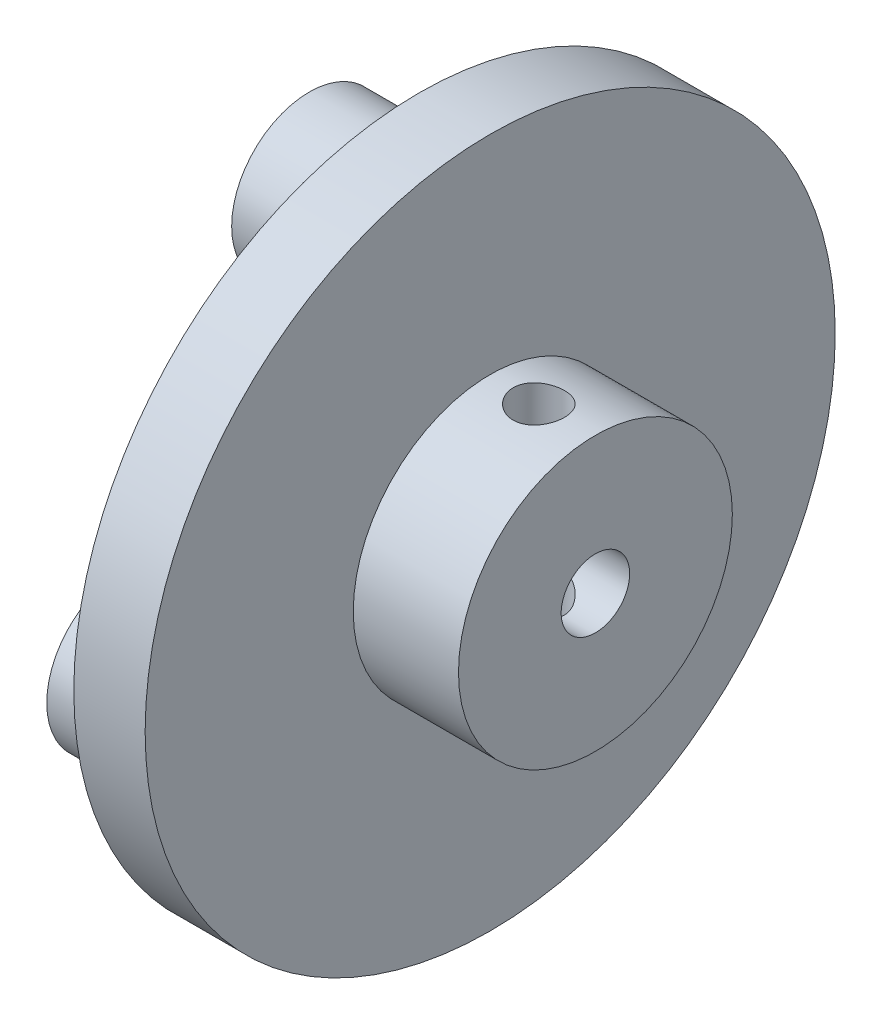
ISO-10303-21;
HEADER;
FILE_DESCRIPTION(('STEP AP214'),'2;1');
FILE_NAME('part.step','',(''),(''),'','','');
FILE_SCHEMA(('AUTOMOTIVE_DESIGN { 1 0 10303 214 1 1 1 1 }'));
ENDSEC;
DATA;
#1=APPLICATION_CONTEXT('core data for automotive mechanical design processes');
#2=APPLICATION_PROTOCOL_DEFINITION('international standard','automotive_design',2000,#1);
#3=PRODUCT_CONTEXT('',#1,'mechanical');
#4=PRODUCT('Part','Part','',(#3));
#5=PRODUCT_RELATED_PRODUCT_CATEGORY('part','',(#4));
#6=PRODUCT_DEFINITION_FORMATION('','',#4);
#7=PRODUCT_DEFINITION_CONTEXT('part definition',#1,'design');
#8=PRODUCT_DEFINITION('design','',#6,#7);
#9=PRODUCT_DEFINITION_SHAPE('','',#8);
#10=(LENGTH_UNIT() NAMED_UNIT(*) SI_UNIT(.MILLI.,.METRE.));
#11=(NAMED_UNIT(*) PLANE_ANGLE_UNIT() SI_UNIT($,.RADIAN.));
#12=(NAMED_UNIT(*) SI_UNIT($,.STERADIAN.) SOLID_ANGLE_UNIT());
#13=UNCERTAINTY_MEASURE_WITH_UNIT(LENGTH_MEASURE(1.E-05),#10,'distance_accuracy_value','');
#14=(GEOMETRIC_REPRESENTATION_CONTEXT(3) GLOBAL_UNCERTAINTY_ASSIGNED_CONTEXT((#13)) GLOBAL_UNIT_ASSIGNED_CONTEXT((#10,
#11,#12)) REPRESENTATION_CONTEXT('',''));
#15=CARTESIAN_POINT('',(0.,0.,0.));
#16=DIRECTION('',(0.,0.,1.));
#17=DIRECTION('',(1.,0.,0.));
#18=AXIS2_PLACEMENT_3D('',#15,#16,#17);
#19=CARTESIAN_POINT('',(-6.42681573579621,0.,0.));
#20=DIRECTION('',(1.,0.,0.));
#21=DIRECTION('',(0.,0.,-1.));
#22=AXIS2_PLACEMENT_3D('',#19,#20,#21);
#23=PLANE('',#22);
#24=CARTESIAN_POINT('',(-6.42681573579621,0.,0.));
#25=DIRECTION('',(1.,0.,0.));
#26=DIRECTION('',(0.,0.,-1.));
#27=AXIS2_PLACEMENT_3D('',#24,#25,#26);
#28=CIRCLE('',#27,5.);
#29=CARTESIAN_POINT('',(-6.42681573579621,0.,-5.));
#30=VERTEX_POINT('',#29);
#31=EDGE_CURVE('E126',#30,#30,#28,.T.);
#32=ORIENTED_EDGE('',*,*,#31,.F.);
#33=EDGE_LOOP('',(#32));
#34=FACE_BOUND('',#33,.T.);
#35=CARTESIAN_POINT('',(-6.42681573579621,0.,0.));
#36=DIRECTION('',(1.,0.,0.));
#37=DIRECTION('',(0.,0.,-1.));
#38=AXIS2_PLACEMENT_3D('',#35,#36,#37);
#39=CIRCLE('',#38,1.5875);
#40=CARTESIAN_POINT('',(-6.42681573579621,0.,-1.5875));
#41=VERTEX_POINT('',#40);
#42=EDGE_CURVE('E129',#41,#41,#39,.T.);
#43=ORIENTED_EDGE('',*,*,#42,.T.);
#44=EDGE_LOOP('',(#43));
#45=FACE_BOUND('',#44,.T.);
#46=ADVANCED_FACE('F47',(#34,#45),#23,.F.);
#47=CARTESIAN_POINT('',(0.,0.,0.));
#48=DIRECTION('',(1.,0.,0.));
#49=DIRECTION('',(0.,0.,-1.));
#50=AXIS2_PLACEMENT_3D('',#47,#48,#49);
#51=CYLINDRICAL_SURFACE('',#50,1.5875);
#52=CARTESIAN_POINT('',(-2.62369481915258,-1.05003255157876,1.190625));
#53=CARTESIAN_POINT('',(-2.56813436430848,-1.050045445975,1.19061880120499));
#54=CARTESIAN_POINT('',(-2.51253343816749,-1.05454741000987,1.18668886577821));
#55=CARTESIAN_POINT('',(-2.4035642457863,-1.07148823701036,1.17140301985762));
#56=CARTESIAN_POINT('',(-2.35020314091834,-1.08395075602632,1.16002497361435));
#57=CARTESIAN_POINT('',(-2.24779081580399,-1.11422757784016,1.13096547199778));
#58=CARTESIAN_POINT('',(-2.19869029009737,-1.13196567044321,1.11337314984434));
#59=CARTESIAN_POINT('',(-2.1043081146867,-1.17067373681068,1.0725995764387));
#60=CARTESIAN_POINT('',(-2.05902600431763,-1.1916433198529,1.04941900067592));
#61=CARTESIAN_POINT('',(-1.96320528707628,-1.2396574216291,0.992504284125243));
#62=CARTESIAN_POINT('',(-1.91355214636031,-1.26705442557768,0.957576618231006));
#63=CARTESIAN_POINT('',(-1.82000273032277,-1.321761740015,0.880535424277006));
#64=CARTESIAN_POINT('',(-1.77611510332648,-1.34907186163527,0.838411314369719));
#65=CARTESIAN_POINT('',(-1.6863881953448,-1.40702174808774,0.737878090100433));
#66=CARTESIAN_POINT('',(-1.64198008306869,-1.43720281226121,0.677900035756592));
#67=CARTESIAN_POINT('',(-1.56433844132807,-1.49131980240358,0.548631836139914));
#68=CARTESIAN_POINT('',(-1.53107865803671,-1.51527037067959,0.479364114482457));
#69=CARTESIAN_POINT('',(-1.48608621846711,-1.54808443073509,0.355496037787017));
#70=CARTESIAN_POINT('',(-1.47088637421967,-1.55931958043549,0.30277280194345));
#71=CARTESIAN_POINT('',(-1.44784141458016,-1.57643223525434,0.194907383645005));
#72=CARTESIAN_POINT('',(-1.43998990936785,-1.58231439499439,0.139767346508665));
#73=CARTESIAN_POINT('',(-1.43210006789922,-1.58822529365106,0.0284679172687339));
#74=CARTESIAN_POINT('',(-1.43208203349128,-1.58823882295637,-0.0276937463004202));
#75=CARTESIAN_POINT('',(-1.43991030647193,-1.58237401411808,-0.139157199360017));
#76=CARTESIAN_POINT('',(-1.44775843508592,-1.57649431153499,-0.194458786708893));
#77=CARTESIAN_POINT('',(-1.47044040305828,-1.55965031243376,-0.300743297572917));
#78=CARTESIAN_POINT('',(-1.48502577822232,-1.54886705851508,-0.35180926291256));
#79=CARTESIAN_POINT('',(-1.52037886013472,-1.52306558684007,-0.450596385005578));
#80=CARTESIAN_POINT('',(-1.5411479149349,-1.50804644569141,-0.498316809620449));
#81=CARTESIAN_POINT('',(-1.59065270117417,-1.472890802502,-0.59469093173013));
#82=CARTESIAN_POINT('',(-1.62000754584371,-1.45237629107677,-0.642886211616419));
#83=CARTESIAN_POINT('',(-1.68447719667917,-1.40859432596468,-0.733875255122701));
#84=CARTESIAN_POINT('',(-1.71959691127687,-1.38532453106985,-0.776664360293094));
#85=CARTESIAN_POINT('',(-1.8023408522792,-1.33265676661186,-0.864458871498922));
#86=CARTESIAN_POINT('',(-1.85106587961103,-1.3029537684393,-0.908244413225474));
#87=CARTESIAN_POINT('',(-1.95522601990249,-1.24401229387742,-0.987431949727557));
#88=CARTESIAN_POINT('',(-2.01066431065059,-1.21477404494797,-1.0228299505536));
#89=CARTESIAN_POINT('',(-2.11647417866004,-1.16537919386833,-1.07849357589208));
#90=CARTESIAN_POINT('',(-2.16569078635997,-1.14456844833299,-1.10036663076556));
#91=CARTESIAN_POINT('',(-2.26814663627921,-1.10757288373056,-1.13759771455097));
#92=CARTESIAN_POINT('',(-2.3213764624068,-1.09137763785656,-1.15297046685305));
#93=CARTESIAN_POINT('',(-2.42024633095124,-1.06870540179809,-1.17397518372094));
#94=CARTESIAN_POINT('',(-2.46529969058283,-1.06093847023266,-1.18093386412912));
#95=CARTESIAN_POINT('',(-2.55650822042805,-1.05120748322928,-1.18960709991958));
#96=CARTESIAN_POINT('',(-2.60266190457544,-1.04923600365031,-1.19132836468154));
#97=CARTESIAN_POINT('',(-2.69471876884096,-1.05142402102457,-1.18939683154219));
#98=CARTESIAN_POINT('',(-2.740621850514,-1.05558577464436,-1.1857420555772));
#99=CARTESIAN_POINT('',(-2.8309240151541,-1.06934967402693,-1.17334131022126));
#100=CARTESIAN_POINT('',(-2.87532039377388,-1.0789611050858,-1.16458665082263));
#101=CARTESIAN_POINT('',(-2.9779756423228,-1.10670783140943,-1.13834830402644));
#102=CARTESIAN_POINT('',(-3.03520335757263,-1.12668703809744,-1.11882388129336));
#103=CARTESIAN_POINT('',(-3.14463902716692,-1.1710817723223,-1.07226796784258));
#104=CARTESIAN_POINT('',(-3.19683749850528,-1.19550543916301,-1.04522265503785));
#105=CARTESIAN_POINT('',(-3.29786559429077,-1.24704699135672,-0.983216332051273));
#106=CARTESIAN_POINT('',(-3.34650966465082,-1.27422976552799,-0.948008248603959));
#107=CARTESIAN_POINT('',(-3.43808398313932,-1.32832083103687,-0.870605343134576));
#108=CARTESIAN_POINT('',(-3.48101143699379,-1.3552289822489,-0.828407126793552));
#109=CARTESIAN_POINT('',(-3.56927093125838,-1.41255926707429,-0.727261145352261));
#110=CARTESIAN_POINT('',(-3.61308453999579,-1.44246738243752,-0.666667665064066));
#111=CARTESIAN_POINT('',(-3.6894000263292,-1.49584651911049,-0.536219092541942));
#112=CARTESIAN_POINT('',(-3.72192638616398,-1.519331448665,-0.466384505042537));
#113=CARTESIAN_POINT('',(-3.76545497486353,-1.55114153831889,-0.341912306313172));
#114=CARTESIAN_POINT('',(-3.77999552381496,-1.56190535686026,-0.28912348300368));
#115=CARTESIAN_POINT('',(-3.80172205122167,-1.57805648311366,-0.181264294065453));
#116=CARTESIAN_POINT('',(-3.8089146051317,-1.58344859766149,-0.126196014246041));
#117=CARTESIAN_POINT('',(-3.81552345445215,-1.58840143581668,-0.0151984122151906));
#118=CARTESIAN_POINT('',(-3.81492149542274,-1.58794847048757,0.0407326247410015));
#119=CARTESIAN_POINT('',(-3.80593703230722,-1.58121987574774,0.151613402505127));
#120=CARTESIAN_POINT('',(-3.79755245547226,-1.57494269517078,0.206562877919336));
#121=CARTESIAN_POINT('',(-3.77385847944483,-1.55736449484374,0.312358036108635));
#122=CARTESIAN_POINT('',(-3.75875717522859,-1.54621460816848,0.363276543980958));
#123=CARTESIAN_POINT('',(-3.72241304206754,-1.51973534456514,0.461693691083553));
#124=CARTESIAN_POINT('',(-3.70116889941179,-1.50440507365769,0.509191596064872));
#125=CARTESIAN_POINT('',(-3.65058670618578,-1.46857753504696,0.605272235896158));
#126=CARTESIAN_POINT('',(-3.6206043923859,-1.44769167461642,0.653368356641276));
#127=CARTESIAN_POINT('',(-3.55486958196267,-1.403234954476,0.744073006806096));
#128=CARTESIAN_POINT('',(-3.51911178205677,-1.37966163294053,0.786676427329303));
#129=CARTESIAN_POINT('',(-3.43490305944494,-1.32640667727172,0.874017021494157));
#130=CARTESIAN_POINT('',(-3.38534048959715,-1.29643919738103,0.91750905161459));
#131=CARTESIAN_POINT('',(-3.27943703708205,-1.2371870295527,0.995959824095467));
#132=CARTESIAN_POINT('',(-3.22309368223605,-1.20790259531752,1.03091544004403));
#133=CARTESIAN_POINT('',(-3.11670623899652,-1.15926871150369,1.0850242722053));
#134=CARTESIAN_POINT('',(-3.06792892662924,-1.13913939849812,1.10595986530786));
#135=CARTESIAN_POINT('',(-2.96652900691447,-1.10357098191916,1.14145534685201));
#136=CARTESIAN_POINT('',(-2.91391705144868,-1.08811945745384,1.15603216594685));
#137=CARTESIAN_POINT('',(-2.82150666984751,-1.06785111060464,1.17472664594127));
#138=CARTESIAN_POINT('',(-2.78247095631577,-1.06124478398383,1.18065747665075));
#139=CARTESIAN_POINT('',(-2.70352834230711,-1.05233228217761,1.18860759763756));
#140=CARTESIAN_POINT('',(-2.66362203090349,-1.05002328532472,1.19062945461798));
#141=CARTESIAN_POINT('',(-2.62369481915258,-1.05003255157876,1.190625));
#142=B_SPLINE_CURVE_WITH_KNOTS('',3,(#52,#53,#54,#55,#56,#57,#58,#59,#60,#61,#62,#63,#64,#65,
#66,#67,#68,#69,#70,#71,#72,#73,#74,#75,#76,#77,#78,#79,#80,#81,#82,#83,#84,#85,#86,#87,#88,#89,
#90,#91,#92,#93,#94,#95,#96,#97,#98,#99,#100,#101,#102,#103,#104,#105,#106,#107,#108,#109,#110,
#111,#112,#113,#114,#115,#116,#117,#118,#119,#120,#121,#122,#123,#124,#125,#126,#127,#128,#129,
#130,#131,#132,#133,#134,#135,#136,#137,#138,#139,#140,#141),.UNSPECIFIED.,.T.,.F.,(4,2,2,2,2,2,
2,2,2,2,2,2,2,2,2,2,2,2,2,2,2,2,2,2,2,2,2,2,2,2,2,2,2,2,2,2,2,2,2,2,2,2,2,2,4),(0.,
0.166474597743314,0.333446217300252,0.498114149835985,0.662762187833674,0.861895093986152,
1.0613233713153,1.30147098182183,1.5410490153444,1.70837006939059,1.87554549222377,
2.04315417765197,2.21080167790273,2.37270731241696,2.53464826848756,2.71412370017785,
2.89375274442083,3.10871804281232,3.32378549783047,3.49646406272525,3.66874938249073,
3.80688854402059,3.9448506680219,4.08286356658931,4.22111232464965,4.41110709885653,
4.60145338469826,4.79856172215235,4.99576605498253,5.23599171487224,5.47569301565586,
5.64239486354326,5.80894740496725,5.97589007623953,6.14287722220568,6.30501670074205,
6.46719088019845,6.64773604163628,6.82844793934811,7.0449089208391,7.26144906140521,
7.43123259464913,7.60056126707079,7.72027294583552,7.83990599300724),.UNSPECIFIED.);
#143=CARTESIAN_POINT('',(-2.62369481915258,-1.05003255157876,1.190625));
#144=VERTEX_POINT('',#143);
#145=EDGE_CURVE('E99',#144,#144,#142,.T.);
#146=ORIENTED_EDGE('',*,*,#145,.F.);
#147=EDGE_LOOP('',(#146));
#148=FACE_BOUND('',#147,.T.);
#149=CARTESIAN_POINT('',(-2.62369481915258,1.05003255157876,1.190625));
#150=CARTESIAN_POINT('',(-2.67925527399667,1.050045445975,1.19061880120499));
#151=CARTESIAN_POINT('',(-2.73485620013766,1.05454741000987,1.18668886577821));
#152=CARTESIAN_POINT('',(-2.84382539251885,1.07148823701036,1.17140301985762));
#153=CARTESIAN_POINT('',(-2.89718649738681,1.08395075602632,1.16002497361435));
#154=CARTESIAN_POINT('',(-2.99959882250116,1.11422757784016,1.13096547199778));
#155=CARTESIAN_POINT('',(-3.04869934820778,1.13196567044321,1.11337314984434));
#156=CARTESIAN_POINT('',(-3.14308152361845,1.17067373681068,1.0725995764387));
#157=CARTESIAN_POINT('',(-3.18836363398752,1.1916433198529,1.04941900067592));
#158=CARTESIAN_POINT('',(-3.28418435122887,1.2396574216291,0.992504284125243));
#159=CARTESIAN_POINT('',(-3.33383749194484,1.26705442557768,0.957576618231006));
#160=CARTESIAN_POINT('',(-3.42738690798238,1.321761740015,0.880535424277006));
#161=CARTESIAN_POINT('',(-3.47127453497867,1.34907186163527,0.838411314369719));
#162=CARTESIAN_POINT('',(-3.56100144296035,1.40702174808774,0.737878090100432));
#163=CARTESIAN_POINT('',(-3.60540955523646,1.43720281226121,0.677900035756592));
#164=CARTESIAN_POINT('',(-3.68305119697708,1.49131980240358,0.548631836139914));
#165=CARTESIAN_POINT('',(-3.71631098026844,1.51527037067959,0.479364114482457));
#166=CARTESIAN_POINT('',(-3.76130341983804,1.54808443073509,0.355496037787017));
#167=CARTESIAN_POINT('',(-3.77650326408548,1.55931958043549,0.30277280194345));
#168=CARTESIAN_POINT('',(-3.79954822372499,1.57643223525434,0.194907383645005));
#169=CARTESIAN_POINT('',(-3.8073997289373,1.58231439499439,0.139767346508665));
#170=CARTESIAN_POINT('',(-3.81528957040593,1.58822529365106,0.028467917268734));
#171=CARTESIAN_POINT('',(-3.81530760481387,1.58823882295637,-0.0276937463004201));
#172=CARTESIAN_POINT('',(-3.80747933183322,1.58237401411808,-0.139157199360017));
#173=CARTESIAN_POINT('',(-3.79963120321923,1.57649431153499,-0.194458786708893));
#174=CARTESIAN_POINT('',(-3.77694923524687,1.55965031243376,-0.300743297572917));
#175=CARTESIAN_POINT('',(-3.76236386008283,1.54886705851508,-0.35180926291256));
#176=CARTESIAN_POINT('',(-3.72701077817043,1.52306558684007,-0.450596385005578));
#177=CARTESIAN_POINT('',(-3.70624172337025,1.50804644569141,-0.498316809620449));
#178=CARTESIAN_POINT('',(-3.65673693713098,1.472890802502,-0.59469093173013));
#179=CARTESIAN_POINT('',(-3.62738209246143,1.45237629107677,-0.642886211616419));
#180=CARTESIAN_POINT('',(-3.56291244162598,1.40859432596468,-0.7338752551227));
#181=CARTESIAN_POINT('',(-3.52779272702828,1.38532453106985,-0.776664360293094));
#182=CARTESIAN_POINT('',(-3.44504878602595,1.33265676661186,-0.864458871498922));
#183=CARTESIAN_POINT('',(-3.39632375869412,1.3029537684393,-0.908244413225474));
#184=CARTESIAN_POINT('',(-3.29216361840266,1.24401229387742,-0.987431949727557));
#185=CARTESIAN_POINT('',(-3.23672532765456,1.21477404494797,-1.0228299505536));
#186=CARTESIAN_POINT('',(-3.13091545964511,1.16537919386833,-1.07849357589208));
#187=CARTESIAN_POINT('',(-3.08169885194518,1.14456844833299,-1.10036663076556));
#188=CARTESIAN_POINT('',(-2.97924300202594,1.10757288373056,-1.13759771455097));
#189=CARTESIAN_POINT('',(-2.92601317589835,1.09137763785656,-1.15297046685305));
#190=CARTESIAN_POINT('',(-2.82714330735391,1.06870540179809,-1.17397518372094));
#191=CARTESIAN_POINT('',(-2.78208994772232,1.06093847023266,-1.18093386412912));
#192=CARTESIAN_POINT('',(-2.6908814178771,1.05120748322928,-1.18960709991958));
#193=CARTESIAN_POINT('',(-2.64472773372971,1.04923600365031,-1.19132836468154));
#194=CARTESIAN_POINT('',(-2.55267086946419,1.05142402102457,-1.18939683154219));
#195=CARTESIAN_POINT('',(-2.50676778779115,1.05558577464436,-1.1857420555772));
#196=CARTESIAN_POINT('',(-2.41646562315105,1.06934967402693,-1.17334131022126));
#197=CARTESIAN_POINT('',(-2.37206924453127,1.0789611050858,-1.16458665082263));
#198=CARTESIAN_POINT('',(-2.26941399598235,1.10670783140943,-1.13834830402645));
#199=CARTESIAN_POINT('',(-2.21218628073252,1.12668703809744,-1.11882388129336));
#200=CARTESIAN_POINT('',(-2.10275061113823,1.1710817723223,-1.07226796784258));
#201=CARTESIAN_POINT('',(-2.05055213979987,1.19550543916301,-1.04522265503785));
#202=CARTESIAN_POINT('',(-1.94952404401438,1.24704699135672,-0.983216332051273));
#203=CARTESIAN_POINT('',(-1.90087997365433,1.27422976552799,-0.948008248603959));
#204=CARTESIAN_POINT('',(-1.80930565516584,1.32832083103687,-0.870605343134576));
#205=CARTESIAN_POINT('',(-1.76637820131136,1.3552289822489,-0.828407126793552));
#206=CARTESIAN_POINT('',(-1.67811870704677,1.41255926707429,-0.727261145352261));
#207=CARTESIAN_POINT('',(-1.63430509830936,1.44246738243752,-0.666667665064067));
#208=CARTESIAN_POINT('',(-1.55798961197595,1.49584651911049,-0.536219092541943));
#209=CARTESIAN_POINT('',(-1.52546325214117,1.519331448665,-0.466384505042537));
#210=CARTESIAN_POINT('',(-1.48193466344162,1.55114153831889,-0.341912306313172));
#211=CARTESIAN_POINT('',(-1.46739411449019,1.56190535686026,-0.28912348300368));
#212=CARTESIAN_POINT('',(-1.44566758708348,1.57805648311366,-0.181264294065453));
#213=CARTESIAN_POINT('',(-1.43847503317345,1.58344859766149,-0.126196014246041));
#214=CARTESIAN_POINT('',(-1.431866183853,1.58840143581668,-0.0151984122151906));
#215=CARTESIAN_POINT('',(-1.43246814288241,1.58794847048757,0.0407326247410015));
#216=CARTESIAN_POINT('',(-1.44145260599793,1.58121987574774,0.151613402505127));
#217=CARTESIAN_POINT('',(-1.44983718283289,1.57494269517078,0.206562877919336));
#218=CARTESIAN_POINT('',(-1.47353115886032,1.55736449484374,0.312358036108635));
#219=CARTESIAN_POINT('',(-1.48863246307656,1.54621460816848,0.363276543980958));
#220=CARTESIAN_POINT('',(-1.52497659623761,1.51973534456514,0.461693691083553));
#221=CARTESIAN_POINT('',(-1.54622073889336,1.50440507365769,0.509191596064872));
#222=CARTESIAN_POINT('',(-1.59680293211937,1.46857753504696,0.605272235896158));
#223=CARTESIAN_POINT('',(-1.62678524591925,1.44769167461642,0.653368356641276));
#224=CARTESIAN_POINT('',(-1.69252005634248,1.403234954476,0.744073006806096));
#225=CARTESIAN_POINT('',(-1.72827785624838,1.37966163294053,0.786676427329303));
#226=CARTESIAN_POINT('',(-1.81248657886021,1.32640667727172,0.874017021494157));
#227=CARTESIAN_POINT('',(-1.862049148708,1.29643919738103,0.91750905161459));
#228=CARTESIAN_POINT('',(-1.9679526012231,1.2371870295527,0.995959824095467));
#229=CARTESIAN_POINT('',(-2.0242959560691,1.20790259531752,1.03091544004403));
#230=CARTESIAN_POINT('',(-2.13068339930863,1.15926871150369,1.0850242722053));
#231=CARTESIAN_POINT('',(-2.17946071167591,1.13913939849812,1.10595986530786));
#232=CARTESIAN_POINT('',(-2.28086063139068,1.10357098191916,1.14145534685201));
#233=CARTESIAN_POINT('',(-2.33347258685646,1.08811945745384,1.15603216594685));
#234=CARTESIAN_POINT('',(-2.42588296845764,1.06785111060464,1.17472664594127));
#235=CARTESIAN_POINT('',(-2.46491868198938,1.06124478398383,1.18065747665075));
#236=CARTESIAN_POINT('',(-2.54386129599804,1.05233228217761,1.18860759763756));
#237=CARTESIAN_POINT('',(-2.58376760740166,1.05002328532472,1.19062945461798));
#238=CARTESIAN_POINT('',(-2.62369481915258,1.05003255157876,1.190625));
#239=B_SPLINE_CURVE_WITH_KNOTS('',3,(#149,#150,#151,#152,#153,#154,#155,#156,#157,#158,#159,
#160,#161,#162,#163,#164,#165,#166,#167,#168,#169,#170,#171,#172,#173,#174,#175,#176,#177,#178,
#179,#180,#181,#182,#183,#184,#185,#186,#187,#188,#189,#190,#191,#192,#193,#194,#195,#196,#197,
#198,#199,#200,#201,#202,#203,#204,#205,#206,#207,#208,#209,#210,#211,#212,#213,#214,#215,#216,
#217,#218,#219,#220,#221,#222,#223,#224,#225,#226,#227,#228,#229,#230,#231,#232,#233,#234,#235,
#236,#237,#238),.UNSPECIFIED.,.T.,.F.,(4,2,2,2,2,2,2,2,2,2,2,2,2,2,2,2,2,2,2,2,2,2,2,2,2,2,2,2,
2,2,2,2,2,2,2,2,2,2,2,2,2,2,2,2,4),(0.,0.166474597743314,0.333446217300252,0.498114149835985,
0.662762187833674,0.861895093986153,1.0613233713153,1.30147098182183,1.5410490153444,
1.70837006939059,1.87554549222377,2.04315417765197,2.21080167790273,2.37270731241696,
2.53464826848756,2.71412370017785,2.89375274442083,3.10871804281232,3.32378549783047,
3.49646406272525,3.66874938249073,3.80688854402059,3.94485066802191,4.08286356658931,
4.22111232464965,4.41110709885653,4.60145338469826,4.79856172215235,4.99576605498253,
5.23599171487224,5.47569301565586,5.64239486354326,5.80894740496725,5.97589007623953,
6.14287722220569,6.30501670074205,6.46719088019845,6.64773604163628,6.82844793934812,
7.0449089208391,7.26144906140521,7.43123259464913,7.6005612670708,7.72027294583552,
7.83990599300725),.UNSPECIFIED.);
#240=CARTESIAN_POINT('',(-2.62369481915258,1.05003255157876,1.190625));
#241=VERTEX_POINT('',#240);
#242=EDGE_CURVE('E93',#241,#241,#239,.T.);
#243=ORIENTED_EDGE('',*,*,#242,.F.);
#244=EDGE_LOOP('',(#243));
#245=FACE_BOUND('',#244,.T.);
#246=CARTESIAN_POINT('',(0.,0.,0.));
#247=DIRECTION('',(1.,0.,0.));
#248=DIRECTION('',(0.,0.,-1.));
#249=AXIS2_PLACEMENT_3D('',#246,#247,#248);
#250=CIRCLE('',#249,1.5875);
#251=CARTESIAN_POINT('',(0.,0.,-1.5875));
#252=VERTEX_POINT('',#251);
#253=EDGE_CURVE('E132',#252,#252,#250,.T.);
#254=ORIENTED_EDGE('',*,*,#253,.T.);
#255=EDGE_LOOP('',(#254));
#256=FACE_BOUND('',#255,.T.);
#257=ORIENTED_EDGE('',*,*,#42,.F.);
#258=EDGE_LOOP('',(#257));
#259=FACE_BOUND('',#258,.T.);
#260=ADVANCED_FACE('F104',(#148,#245,#256,#259),#51,.F.);
#261=CARTESIAN_POINT('',(0.,0.,0.));
#262=DIRECTION('',(1.,0.,0.));
#263=DIRECTION('',(0.,0.,-1.));
#264=AXIS2_PLACEMENT_3D('',#261,#262,#263);
#265=PLANE('',#264);
#266=CARTESIAN_POINT('',(0.,0.,0.));
#267=DIRECTION('',(1.,0.,0.));
#268=DIRECTION('',(0.,0.,-1.));
#269=AXIS2_PLACEMENT_3D('',#266,#267,#268);
#270=CIRCLE('',#269,6.35);
#271=CARTESIAN_POINT('',(0.,0.,-6.35));
#272=VERTEX_POINT('',#271);
#273=EDGE_CURVE('E138',#272,#272,#270,.T.);
#274=ORIENTED_EDGE('',*,*,#273,.T.);
#275=EDGE_LOOP('',(#274));
#276=FACE_BOUND('',#275,.T.);
#277=ORIENTED_EDGE('',*,*,#253,.F.);
#278=EDGE_LOOP('',(#277));
#279=FACE_BOUND('',#278,.T.);
#280=ADVANCED_FACE('F107',(#276,#279),#265,.T.);
#281=CARTESIAN_POINT('',(0.,0.,0.));
#282=DIRECTION('',(1.,0.,0.));
#283=DIRECTION('',(0.,0.,-1.));
#284=AXIS2_PLACEMENT_3D('',#281,#282,#283);
#285=CYLINDRICAL_SURFACE('',#284,6.35);
#286=CARTESIAN_POINT('',(-2.62369481915258,-6.23738022805849,1.190625));
#287=CARTESIAN_POINT('',(-2.689938978003,-6.23738151031385,1.19062245907442));
#288=CARTESIAN_POINT('',(-2.75621610302296,-6.23844700897501,1.18507769040044));
#289=CARTESIAN_POINT('',(-2.88690149488208,-6.24258856832369,1.16306007269174));
#290=CARTESIAN_POINT('',(-2.95130812793668,-6.24566633455276,1.14657795328794));
#291=CARTESIAN_POINT('',(-3.07634271956241,-6.25347187545005,1.10320959521414));
#292=CARTESIAN_POINT('',(-3.1369741371677,-6.25819811268953,1.07633304826229));
#293=CARTESIAN_POINT('',(-3.25286358183402,-6.26876624648693,1.01296442822345));
#294=CARTESIAN_POINT('',(-3.30812202773578,-6.27460805597694,0.976473105463744));
#295=CARTESIAN_POINT('',(-3.41238878976756,-6.28683031776661,0.894426701606916));
#296=CARTESIAN_POINT('',(-3.46132052790844,-6.29321605071163,0.848775075156375));
#297=CARTESIAN_POINT('',(-3.55087767839705,-6.30576000771296,0.749912599425359));
#298=CARTESIAN_POINT('',(-3.59150254541471,-6.31191821681104,0.696701254252311));
#299=CARTESIAN_POINT('',(-3.66358619932928,-6.32336982901169,0.583726841315056));
#300=CARTESIAN_POINT('',(-3.69497278638363,-6.32865628516529,0.523916941776878));
#301=CARTESIAN_POINT('',(-3.74722376833218,-6.33770964352422,0.399757331080296));
#302=CARTESIAN_POINT('',(-3.76808902831981,-6.34147667065624,0.335407993663484));
#303=CARTESIAN_POINT('',(-3.79846827336267,-6.3470294312949,0.204789679786261));
#304=CARTESIAN_POINT('',(-3.80811134947871,-6.34883767993707,0.138551700325605));
#305=CARTESIAN_POINT('',(-3.81617472376477,-6.3503467466363,0.0053750178530858));
#306=CARTESIAN_POINT('',(-3.81459597758795,-6.35004774414741,-0.0615636250053379));
#307=CARTESIAN_POINT('',(-3.80035952580452,-6.34739359299572,-0.193356196582646));
#308=CARTESIAN_POINT('',(-3.7878408196675,-6.34506424221226,-0.258225734858354));
#309=CARTESIAN_POINT('',(-3.75229964744511,-6.33864005902264,-0.384926812786658));
#310=CARTESIAN_POINT('',(-3.72927679855934,-6.33454516227535,-0.446758241631066));
#311=CARTESIAN_POINT('',(-3.67324843262505,-6.32500687861013,-0.56603111469027));
#312=CARTESIAN_POINT('',(-3.64018735062203,-6.31955601712718,-0.623445835146835));
#313=CARTESIAN_POINT('',(-3.56506194432258,-6.30790860862137,-0.731964481914119));
#314=CARTESIAN_POINT('',(-3.52299670443556,-6.30171198579361,-0.783067765610435));
#315=CARTESIAN_POINT('',(-3.4302911049094,-6.2891472648395,-0.878336460056673));
#316=CARTESIAN_POINT('',(-3.3795291406803,-6.28277799434412,-0.922383464134014));
#317=CARTESIAN_POINT('',(-3.27127612870017,-6.27067666458918,-1.00135667656938));
#318=CARTESIAN_POINT('',(-3.2137849825019,-6.26494461465447,-1.03628275146501));
#319=CARTESIAN_POINT('',(-3.09354856678234,-6.25476502812528,-1.09605645203179));
#320=CARTESIAN_POINT('',(-3.0307945437575,-6.25031968858395,-1.12088686831053));
#321=CARTESIAN_POINT('',(-2.90190325425478,-6.24325048652372,-1.15961840223951));
#322=CARTESIAN_POINT('',(-2.83576637203365,-6.24062641761904,-1.17352075827755));
#323=CARTESIAN_POINT('',(-2.70305447687322,-6.23753769238923,-1.1898286516573));
#324=CARTESIAN_POINT('',(-2.63650108992245,-6.23704108679058,-1.192404304019));
#325=CARTESIAN_POINT('',(-2.50391520167715,-6.23817801940292,-1.18644169049869));
#326=CARTESIAN_POINT('',(-2.43788267478503,-6.23981145226898,-1.17790397424856));
#327=CARTESIAN_POINT('',(-2.30877220235315,-6.24499465425169,-1.15010301630482));
#328=CARTESIAN_POINT('',(-2.24567435613156,-6.24852848185885,-1.13092895626042));
#329=CARTESIAN_POINT('',(-2.12358692480426,-6.25710056486816,-1.08249421850879));
#330=CARTESIAN_POINT('',(-2.06459764287103,-6.26213893114604,-1.05323279739731));
#331=CARTESIAN_POINT('',(-1.95165239653706,-6.273225149293,-0.985062427887302));
#332=CARTESIAN_POINT('',(-1.89776239222138,-6.27928398243844,-0.946046015889492));
#333=CARTESIAN_POINT('',(-1.79723276223245,-6.2916975652343,-0.859618108232458));
#334=CARTESIAN_POINT('',(-1.75059378916768,-6.29805234145342,-0.812205857750102));
#335=CARTESIAN_POINT('',(-1.66525458184736,-6.31044445304719,-0.709572350434619));
#336=CARTESIAN_POINT('',(-1.62666875678409,-6.31647641192686,-0.654255211438614));
#337=CARTESIAN_POINT('',(-1.55933861174905,-6.32745277568216,-0.537824777663112));
#338=CARTESIAN_POINT('',(-1.53059391288273,-6.33239722242563,-0.476711706149333));
#339=CARTESIAN_POINT('',(-1.48393324147296,-6.34061833534204,-0.350740298628081));
#340=CARTESIAN_POINT('',(-1.46596108277571,-6.3439036406705,-0.285903362881447));
#341=CARTESIAN_POINT('',(-1.44117634957248,-6.34847315903972,-0.154063880484122));
#342=CARTESIAN_POINT('',(-1.43436260083905,-6.34975758263759,-0.0870615624588323));
#343=CARTESIAN_POINT('',(-1.43212898607231,-6.35017643090381,0.0461095409488416));
#344=CARTESIAN_POINT('',(-1.43653632135601,-6.34934346258619,0.11227538748385));
#345=CARTESIAN_POINT('',(-1.45624130869377,-6.34568887873039,0.242906049365365));
#346=CARTESIAN_POINT('',(-1.47153885634329,-6.3428672822572,0.307370881013366));
#347=CARTESIAN_POINT('',(-1.5125172150134,-6.33555246395074,0.432678265003916));
#348=CARTESIAN_POINT('',(-1.53817963312687,-6.33106220435378,0.49352701595884));
#349=CARTESIAN_POINT('',(-1.59913855424138,-6.32089614079585,0.610080719857626));
#350=CARTESIAN_POINT('',(-1.63443570269973,-6.31522025741262,0.665785327846346));
#351=CARTESIAN_POINT('',(-1.71425691111617,-6.30320669013837,0.77133055330038));
#352=CARTESIAN_POINT('',(-1.7589058085303,-6.29686069644355,0.821075824341234));
#353=CARTESIAN_POINT('',(-1.85590406563117,-6.28427459121416,0.912427817519787));
#354=CARTESIAN_POINT('',(-1.90825523401174,-6.27803450493435,0.954032622702936));
#355=CARTESIAN_POINT('',(-2.01975144257333,-6.26630364581951,1.0282843444415));
#356=CARTESIAN_POINT('',(-2.07895486188866,-6.26082034029538,1.06084481547176));
#357=CARTESIAN_POINT('',(-2.20207528994909,-6.25131373440504,1.11550555111084));
#358=CARTESIAN_POINT('',(-2.26598778325827,-6.24728905676022,1.13761568925877));
#359=CARTESIAN_POINT('',(-2.37902319780462,-6.24199456683126,1.16625470485721));
#360=CARTESIAN_POINT('',(-2.42748436238774,-6.24027446636446,1.1753779018103));
#361=CARTESIAN_POINT('',(-2.52518922846208,-6.23796683562345,1.18756391166722));
#362=CARTESIAN_POINT('',(-2.57443290861546,-6.2373792745201,1.1906268895379));
#363=CARTESIAN_POINT('',(-2.62369481915258,-6.23738022805849,1.190625));
#364=B_SPLINE_CURVE_WITH_KNOTS('',3,(#286,#287,#288,#289,#290,#291,#292,#293,#294,#295,#296,
#297,#298,#299,#300,#301,#302,#303,#304,#305,#306,#307,#308,#309,#310,#311,#312,#313,#314,#315,
#316,#317,#318,#319,#320,#321,#322,#323,#324,#325,#326,#327,#328,#329,#330,#331,#332,#333,#334,
#335,#336,#337,#338,#339,#340,#341,#342,#343,#344,#345,#346,#347,#348,#349,#350,#351,#352,#353,
#354,#355,#356,#357,#358,#359,#360,#361,#362,#363),.UNSPECIFIED.,.T.,.F.,(4,2,2,2,2,2,2,2,2,2,2,
2,2,2,2,2,2,2,2,2,2,2,2,2,2,2,2,2,2,2,2,2,2,2,2,2,2,2,4),(0.,0.198552201459807,
0.397272908738174,0.595808774681619,0.794329151675382,0.995063539582096,1.19581110108642,
1.39808826573636,1.60034879586963,1.80025893643956,2.00015205281638,2.19754172660111,
2.39493859439311,2.59344868009848,2.79197896096103,2.9935536296635,3.19513124775091,
3.39705105541248,3.59894797785148,3.79780203563365,3.99664625909981,4.19384791397697,
4.39106410505425,4.590556784791,4.79006740891898,4.99224399609721,5.19441279837102,
5.39551776348454,5.59660156445817,5.79460757324921,5.99261168378094,6.19026596055845,
6.3879334819958,6.58843030804315,6.78897429133668,6.99137382690505,7.19358174998237,
7.341237440971,7.48888911252961),.UNSPECIFIED.);
#365=CARTESIAN_POINT('',(-2.62369481915258,-6.23738022805849,1.190625));
#366=VERTEX_POINT('',#365);
#367=EDGE_CURVE('E50',#366,#366,#364,.T.);
#368=ORIENTED_EDGE('',*,*,#367,.F.);
#369=EDGE_LOOP('',(#368));
#370=FACE_BOUND('',#369,.T.);
#371=CARTESIAN_POINT('',(-2.62369481915258,6.23738022805849,1.190625));
#372=CARTESIAN_POINT('',(-2.55745066030215,6.23738151031385,1.19062245907442));
#373=CARTESIAN_POINT('',(-2.49117353528219,6.23844700897501,1.18507769040044));
#374=CARTESIAN_POINT('',(-2.36048814342307,6.24258856832369,1.16306007269174));
#375=CARTESIAN_POINT('',(-2.29608151036847,6.24566633455276,1.14657795328794));
#376=CARTESIAN_POINT('',(-2.17104691874274,6.25347187545005,1.10320959521414));
#377=CARTESIAN_POINT('',(-2.11041550113745,6.25819811268953,1.07633304826229));
#378=CARTESIAN_POINT('',(-1.99452605647113,6.26876624648693,1.01296442822345));
#379=CARTESIAN_POINT('',(-1.93926761056937,6.27460805597694,0.976473105463744));
#380=CARTESIAN_POINT('',(-1.83500084853759,6.28683031776661,0.894426701606916));
#381=CARTESIAN_POINT('',(-1.78606911039671,6.29321605071163,0.848775075156375));
#382=CARTESIAN_POINT('',(-1.6965119599081,6.30576000771296,0.749912599425359));
#383=CARTESIAN_POINT('',(-1.65588709289044,6.31191821681104,0.69670125425231));
#384=CARTESIAN_POINT('',(-1.58380343897587,6.32336982901169,0.583726841315055));
#385=CARTESIAN_POINT('',(-1.55241685192152,6.32865628516529,0.523916941776878));
#386=CARTESIAN_POINT('',(-1.50016586997297,6.33770964352422,0.399757331080295));
#387=CARTESIAN_POINT('',(-1.47930060998534,6.34147667065624,0.335407993663483));
#388=CARTESIAN_POINT('',(-1.44892136494248,6.3470294312949,0.20478967978626));
#389=CARTESIAN_POINT('',(-1.43927828882644,6.34883767993707,0.138551700325605));
#390=CARTESIAN_POINT('',(-1.43121491454038,6.3503467466363,0.00537501785308539));
#391=CARTESIAN_POINT('',(-1.4327936607172,6.35004774414741,-0.0615636250053382));
#392=CARTESIAN_POINT('',(-1.44703011250063,6.34739359299572,-0.193356196582646));
#393=CARTESIAN_POINT('',(-1.45954881863765,6.34506424221226,-0.258225734858354));
#394=CARTESIAN_POINT('',(-1.49508999086004,6.33864005902264,-0.384926812786659));
#395=CARTESIAN_POINT('',(-1.51811283974581,6.33454516227535,-0.446758241631067));
#396=CARTESIAN_POINT('',(-1.5741412056801,6.32500687861013,-0.56603111469027));
#397=CARTESIAN_POINT('',(-1.60720228768312,6.31955601712718,-0.623445835146835));
#398=CARTESIAN_POINT('',(-1.68232769398257,6.30790860862137,-0.731964481914119));
#399=CARTESIAN_POINT('',(-1.72439293386959,6.30171198579361,-0.783067765610435));
#400=CARTESIAN_POINT('',(-1.81709853339575,6.2891472648395,-0.878336460056674));
#401=CARTESIAN_POINT('',(-1.86786049762485,6.28277799434412,-0.922383464134014));
#402=CARTESIAN_POINT('',(-1.97611350960498,6.27067666458918,-1.00135667656938));
#403=CARTESIAN_POINT('',(-2.03360465580325,6.26494461465447,-1.03628275146501));
#404=CARTESIAN_POINT('',(-2.15384107152281,6.25476502812528,-1.09605645203179));
#405=CARTESIAN_POINT('',(-2.21659509454765,6.25031968858395,-1.12088686831053));
#406=CARTESIAN_POINT('',(-2.34548638405037,6.24325048652372,-1.15961840223951));
#407=CARTESIAN_POINT('',(-2.4116232662715,6.24062641761904,-1.17352075827755));
#408=CARTESIAN_POINT('',(-2.54433516143193,6.23753769238923,-1.1898286516573));
#409=CARTESIAN_POINT('',(-2.6108885483827,6.23704108679058,-1.192404304019));
#410=CARTESIAN_POINT('',(-2.743474436628,6.23817801940292,-1.18644169049869));
#411=CARTESIAN_POINT('',(-2.80950696352012,6.23981145226898,-1.17790397424856));
#412=CARTESIAN_POINT('',(-2.938617435952,6.24499465425169,-1.15010301630482));
#413=CARTESIAN_POINT('',(-3.00171528217359,6.24852848185885,-1.13092895626042));
#414=CARTESIAN_POINT('',(-3.12380271350089,6.25710056486816,-1.08249421850879));
#415=CARTESIAN_POINT('',(-3.18279199543412,6.26213893114604,-1.05323279739731));
#416=CARTESIAN_POINT('',(-3.29573724176809,6.273225149293,-0.985062427887301));
#417=CARTESIAN_POINT('',(-3.34962724608377,6.27928398243844,-0.946046015889492));
#418=CARTESIAN_POINT('',(-3.4501568760727,6.2916975652343,-0.859618108232457));
#419=CARTESIAN_POINT('',(-3.49679584913747,6.29805234145342,-0.812205857750101));
#420=CARTESIAN_POINT('',(-3.58213505645779,6.31044445304719,-0.709572350434618));
#421=CARTESIAN_POINT('',(-3.62072088152106,6.31647641192686,-0.654255211438612));
#422=CARTESIAN_POINT('',(-3.6880510265561,6.32745277568216,-0.537824777663111));
#423=CARTESIAN_POINT('',(-3.71679572542242,6.33239722242563,-0.476711706149332));
#424=CARTESIAN_POINT('',(-3.76345639683219,6.34061833534204,-0.35074029862808));
#425=CARTESIAN_POINT('',(-3.78142855552944,6.3439036406705,-0.285903362881446));
#426=CARTESIAN_POINT('',(-3.80621328873267,6.34847315903972,-0.154063880484121));
#427=CARTESIAN_POINT('',(-3.8130270374661,6.34975758263759,-0.0870615624588314));
#428=CARTESIAN_POINT('',(-3.81526065223284,6.35017643090381,0.0461095409488419));
#429=CARTESIAN_POINT('',(-3.81085331694914,6.34934346258619,0.112275387483851));
#430=CARTESIAN_POINT('',(-3.79114832961138,6.34568887873039,0.242906049365365));
#431=CARTESIAN_POINT('',(-3.77585078196186,6.3428672822572,0.307370881013366));
#432=CARTESIAN_POINT('',(-3.73487242329175,6.33555246395074,0.432678265003916));
#433=CARTESIAN_POINT('',(-3.70921000517828,6.33106220435378,0.493527015958841));
#434=CARTESIAN_POINT('',(-3.64825108406377,6.32089614079585,0.610080719857626));
#435=CARTESIAN_POINT('',(-3.61295393560542,6.31522025741262,0.665785327846346));
#436=CARTESIAN_POINT('',(-3.53313272718898,6.30320669013837,0.771330553300381));
#437=CARTESIAN_POINT('',(-3.48848382977485,6.29686069644355,0.821075824341235));
#438=CARTESIAN_POINT('',(-3.39148557267398,6.28427459121416,0.912427817519787));
#439=CARTESIAN_POINT('',(-3.33913440429341,6.27803450493435,0.954032622702936));
#440=CARTESIAN_POINT('',(-3.22763819573182,6.26630364581951,1.0282843444415));
#441=CARTESIAN_POINT('',(-3.16843477641649,6.26082034029538,1.06084481547176));
#442=CARTESIAN_POINT('',(-3.04531434835606,6.25131373440504,1.11550555111084));
#443=CARTESIAN_POINT('',(-2.98140185504688,6.24728905676022,1.13761568925877));
#444=CARTESIAN_POINT('',(-2.86836644050053,6.24199456683126,1.16625470485721));
#445=CARTESIAN_POINT('',(-2.81990527591741,6.24027446636446,1.1753779018103));
#446=CARTESIAN_POINT('',(-2.72220040984307,6.23796683562345,1.18756391166722));
#447=CARTESIAN_POINT('',(-2.67295672968969,6.2373792745201,1.1906268895379));
#448=CARTESIAN_POINT('',(-2.62369481915258,6.23738022805849,1.190625));
#449=B_SPLINE_CURVE_WITH_KNOTS('',3,(#371,#372,#373,#374,#375,#376,#377,#378,#379,#380,#381,
#382,#383,#384,#385,#386,#387,#388,#389,#390,#391,#392,#393,#394,#395,#396,#397,#398,#399,#400,
#401,#402,#403,#404,#405,#406,#407,#408,#409,#410,#411,#412,#413,#414,#415,#416,#417,#418,#419,
#420,#421,#422,#423,#424,#425,#426,#427,#428,#429,#430,#431,#432,#433,#434,#435,#436,#437,#438,
#439,#440,#441,#442,#443,#444,#445,#446,#447,#448),.UNSPECIFIED.,.T.,.F.,(4,2,2,2,2,2,2,2,2,2,2,
2,2,2,2,2,2,2,2,2,2,2,2,2,2,2,2,2,2,2,2,2,2,2,2,2,2,2,4),(0.,0.198552201459807,
0.397272908738174,0.595808774681619,0.794329151675382,0.995063539582097,1.19581110108642,
1.39808826573636,1.60034879586963,1.80025893643956,2.00015205281638,2.19754172660111,
2.39493859439311,2.59344868009848,2.79197896096103,2.9935536296635,3.19513124775091,
3.39705105541248,3.59894797785148,3.79780203563365,3.99664625909981,4.19384791397698,
4.39106410505426,4.590556784791,4.79006740891899,4.99224399609721,5.19441279837102,
5.39551776348454,5.59660156445817,5.79460757324921,5.99261168378094,6.19026596055845,
6.3879334819958,6.58843030804315,6.78897429133668,6.99137382690505,7.19358174998237,
7.341237440971,7.48888911252961),.UNSPECIFIED.);
#450=CARTESIAN_POINT('',(-2.62369481915258,6.23738022805849,1.190625));
#451=VERTEX_POINT('',#450);
#452=EDGE_CURVE('E69',#451,#451,#449,.T.);
#453=ORIENTED_EDGE('',*,*,#452,.F.);
#454=EDGE_LOOP('',(#453));
#455=FACE_BOUND('',#454,.T.);
#456=CARTESIAN_POINT('',(-4.87911158009766,0.,0.));
#457=DIRECTION('',(1.,0.,0.));
#458=DIRECTION('',(0.,0.,-1.));
#459=AXIS2_PLACEMENT_3D('',#456,#457,#458);
#460=CIRCLE('',#459,6.35);
#461=CARTESIAN_POINT('',(-4.87911158009766,0.,-6.35));
#462=VERTEX_POINT('',#461);
#463=EDGE_CURVE('E143',#462,#462,#460,.T.);
#464=ORIENTED_EDGE('',*,*,#463,.T.);
#465=EDGE_LOOP('',(#464));
#466=FACE_BOUND('',#465,.T.);
#467=ORIENTED_EDGE('',*,*,#273,.F.);
#468=EDGE_LOOP('',(#467));
#469=FACE_BOUND('',#468,.T.);
#470=ADVANCED_FACE('F75',(#370,#455,#466,#469),#285,.T.);
#471=CARTESIAN_POINT('',(-4.87911158009766,0.,0.));
#472=DIRECTION('',(1.,0.,0.));
#473=DIRECTION('',(0.,0.,-1.));
#474=AXIS2_PLACEMENT_3D('',#471,#472,#473);
#475=PLANE('',#474);
#476=CARTESIAN_POINT('',(-4.87911158009766,0.,0.));
#477=DIRECTION('',(1.,0.,0.));
#478=DIRECTION('',(0.,0.,-1.));
#479=AXIS2_PLACEMENT_3D('',#476,#477,#478);
#480=CIRCLE('',#479,16.);
#481=CARTESIAN_POINT('',(-4.87911158009766,0.,-16.));
#482=VERTEX_POINT('',#481);
#483=EDGE_CURVE('E147',#482,#482,#480,.T.);
#484=ORIENTED_EDGE('',*,*,#483,.T.);
#485=EDGE_LOOP('',(#484));
#486=FACE_BOUND('',#485,.T.);
#487=ORIENTED_EDGE('',*,*,#463,.F.);
#488=EDGE_LOOP('',(#487));
#489=FACE_BOUND('',#488,.T.);
#490=ADVANCED_FACE('F115',(#486,#489),#475,.T.);
#491=CARTESIAN_POINT('',(0.,0.,0.));
#492=DIRECTION('',(1.,0.,0.));
#493=DIRECTION('',(0.,0.,-1.));
#494=AXIS2_PLACEMENT_3D('',#491,#492,#493);
#495=CYLINDRICAL_SURFACE('',#494,16.);
#496=CARTESIAN_POINT('',(-8.1873872368468,0.,0.));
#497=DIRECTION('',(1.,0.,0.));
#498=DIRECTION('',(0.,0.,-1.));
#499=AXIS2_PLACEMENT_3D('',#496,#497,#498);
#500=CIRCLE('',#499,16.);
#501=CARTESIAN_POINT('',(-8.1873872368468,0.,-16.));
#502=VERTEX_POINT('',#501);
#503=EDGE_CURVE('E151',#502,#502,#500,.T.);
#504=ORIENTED_EDGE('',*,*,#503,.T.);
#505=EDGE_LOOP('',(#504));
#506=FACE_BOUND('',#505,.T.);
#507=ORIENTED_EDGE('',*,*,#483,.F.);
#508=EDGE_LOOP('',(#507));
#509=FACE_BOUND('',#508,.T.);
#510=ADVANCED_FACE('F191',(#506,#509),#495,.T.);
#511=CARTESIAN_POINT('',(-8.1873872368468,0.,0.));
#512=DIRECTION('',(1.,0.,0.));
#513=DIRECTION('',(0.,0.,-1.));
#514=AXIS2_PLACEMENT_3D('',#511,#512,#513);
#515=PLANE('',#514);
#516=CARTESIAN_POINT('',(-8.1873872368468,-4.95,-8.57365149746595));
#517=DIRECTION('',(1.,0.,0.));
#518=DIRECTION('',(0.,0.,-1.));
#519=AXIS2_PLACEMENT_3D('',#516,#517,#518);
#520=CIRCLE('',#519,3.6);
#521=CARTESIAN_POINT('',(-8.1873872368468,-4.95,-12.1736514974659));
#522=VERTEX_POINT('',#521);
#523=EDGE_CURVE('E10',#522,#522,#520,.F.);
#524=ORIENTED_EDGE('',*,*,#523,.F.);
#525=EDGE_LOOP('',(#524));
#526=FACE_BOUND('',#525,.T.);
#527=CARTESIAN_POINT('',(-8.1873872368468,-4.95,8.57365149746595));
#528=DIRECTION('',(1.,0.,0.));
#529=DIRECTION('',(0.,0.,-1.));
#530=AXIS2_PLACEMENT_3D('',#527,#528,#529);
#531=CIRCLE('',#530,3.6);
#532=CARTESIAN_POINT('',(-8.1873872368468,-4.95,4.97365149746594));
#533=VERTEX_POINT('',#532);
#534=EDGE_CURVE('E60',#533,#533,#531,.F.);
#535=ORIENTED_EDGE('',*,*,#534,.F.);
#536=EDGE_LOOP('',(#535));
#537=FACE_BOUND('',#536,.T.);
#538=CARTESIAN_POINT('',(-8.1873872368468,9.9,0.));
#539=DIRECTION('',(1.,0.,0.));
#540=DIRECTION('',(0.,0.,-1.));
#541=AXIS2_PLACEMENT_3D('',#538,#539,#540);
#542=CIRCLE('',#541,3.6);
#543=CARTESIAN_POINT('',(-8.1873872368468,9.9,-3.6));
#544=VERTEX_POINT('',#543);
#545=EDGE_CURVE('E66',#544,#544,#542,.F.);
#546=ORIENTED_EDGE('',*,*,#545,.F.);
#547=EDGE_LOOP('',(#546));
#548=FACE_BOUND('',#547,.T.);
#549=ORIENTED_EDGE('',*,*,#503,.F.);
#550=EDGE_LOOP('',(#549));
#551=FACE_BOUND('',#550,.T.);
#552=CARTESIAN_POINT('',(-8.1873872368468,0.,0.));
#553=DIRECTION('',(1.,0.,0.));
#554=DIRECTION('',(0.,0.,-1.));
#555=AXIS2_PLACEMENT_3D('',#552,#553,#554);
#556=CIRCLE('',#555,5.);
#557=CARTESIAN_POINT('',(-8.1873872368468,0.,-5.));
#558=VERTEX_POINT('',#557);
#559=EDGE_CURVE('E155',#558,#558,#556,.T.);
#560=ORIENTED_EDGE('',*,*,#559,.T.);
#561=EDGE_LOOP('',(#560));
#562=FACE_BOUND('',#561,.T.);
#563=ADVANCED_FACE('F196',(#526,#537,#548,#551,#562),#515,.F.);
#564=CARTESIAN_POINT('',(0.,0.,0.));
#565=DIRECTION('',(1.,0.,0.));
#566=DIRECTION('',(0.,0.,-1.));
#567=AXIS2_PLACEMENT_3D('',#564,#565,#566);
#568=CYLINDRICAL_SURFACE('',#567,5.);
#569=ORIENTED_EDGE('',*,*,#31,.T.);
#570=EDGE_LOOP('',(#569));
#571=FACE_BOUND('',#570,.T.);
#572=ORIENTED_EDGE('',*,*,#559,.F.);
#573=EDGE_LOOP('',(#572));
#574=FACE_BOUND('',#573,.T.);
#575=ADVANCED_FACE('F201',(#571,#574),#568,.F.);
#576=CARTESIAN_POINT('',(-13.2673872368468,9.9,0.));
#577=DIRECTION('',(1.,0.,0.));
#578=DIRECTION('',(0.,0.,-1.));
#579=AXIS2_PLACEMENT_3D('',#576,#577,#578);
#580=CYLINDRICAL_SURFACE('',#579,3.6);
#581=CARTESIAN_POINT('',(-13.2673872368468,9.9,0.));
#582=DIRECTION('',(-1.,0.,0.));
#583=DIRECTION('',(0.,0.,1.));
#584=AXIS2_PLACEMENT_3D('',#581,#582,#583);
#585=CIRCLE('',#584,3.6);
#586=CARTESIAN_POINT('',(-13.2673872368468,9.9,3.6));
#587=VERTEX_POINT('',#586);
#588=EDGE_CURVE('E161',#587,#587,#585,.T.);
#589=ORIENTED_EDGE('',*,*,#588,.F.);
#590=EDGE_LOOP('',(#589));
#591=FACE_BOUND('',#590,.T.);
#592=ORIENTED_EDGE('',*,*,#545,.T.);
#593=EDGE_LOOP('',(#592));
#594=FACE_BOUND('',#593,.T.);
#595=ADVANCED_FACE('F205',(#591,#594),#580,.T.);
#596=CARTESIAN_POINT('',(-13.2673872368468,9.9,0.));
#597=DIRECTION('',(-1.,0.,0.));
#598=DIRECTION('',(0.,0.,1.));
#599=AXIS2_PLACEMENT_3D('',#596,#597,#598);
#600=PLANE('',#599);
#601=ORIENTED_EDGE('',*,*,#588,.T.);
#602=EDGE_LOOP('',(#601));
#603=FACE_BOUND('',#602,.T.);
#604=ADVANCED_FACE('F209',(#603),#600,.T.);
#605=CARTESIAN_POINT('',(-13.2673872368468,-4.95,8.57365149746595));
#606=DIRECTION('',(1.,0.,0.));
#607=DIRECTION('',(0.,0.,-1.));
#608=AXIS2_PLACEMENT_3D('',#605,#606,#607);
#609=CYLINDRICAL_SURFACE('',#608,3.6);
#610=CARTESIAN_POINT('',(-13.2673872368468,-4.95,8.57365149746595));
#611=DIRECTION('',(-1.,0.,0.));
#612=DIRECTION('',(0.,0.,1.));
#613=AXIS2_PLACEMENT_3D('',#610,#611,#612);
#614=CIRCLE('',#613,3.6);
#615=CARTESIAN_POINT('',(-13.2673872368468,-4.95,12.1736514974659));
#616=VERTEX_POINT('',#615);
#617=EDGE_CURVE('E165',#616,#616,#614,.T.);
#618=ORIENTED_EDGE('',*,*,#617,.F.);
#619=EDGE_LOOP('',(#618));
#620=FACE_BOUND('',#619,.T.);
#621=ORIENTED_EDGE('',*,*,#534,.T.);
#622=EDGE_LOOP('',(#621));
#623=FACE_BOUND('',#622,.T.);
#624=ADVANCED_FACE('F212',(#620,#623),#609,.T.);
#625=CARTESIAN_POINT('',(-13.2673872368468,-4.95,8.57365149746595));
#626=DIRECTION('',(-1.,0.,0.));
#627=DIRECTION('',(0.,0.,1.));
#628=AXIS2_PLACEMENT_3D('',#625,#626,#627);
#629=PLANE('',#628);
#630=ORIENTED_EDGE('',*,*,#617,.T.);
#631=EDGE_LOOP('',(#630));
#632=FACE_BOUND('',#631,.T.);
#633=ADVANCED_FACE('F214',(#632),#629,.T.);
#634=CARTESIAN_POINT('',(-13.2673872368468,-4.95,-8.57365149746595));
#635=DIRECTION('',(1.,0.,0.));
#636=DIRECTION('',(0.,0.,-1.));
#637=AXIS2_PLACEMENT_3D('',#634,#635,#636);
#638=CYLINDRICAL_SURFACE('',#637,3.6);
#639=CARTESIAN_POINT('',(-13.2673872368468,-4.95,-8.57365149746595));
#640=DIRECTION('',(-1.,0.,0.));
#641=DIRECTION('',(0.,0.,1.));
#642=AXIS2_PLACEMENT_3D('',#639,#640,#641);
#643=CIRCLE('',#642,3.6);
#644=CARTESIAN_POINT('',(-13.2673872368468,-4.95,-4.97365149746595));
#645=VERTEX_POINT('',#644);
#646=EDGE_CURVE('E168',#645,#645,#643,.T.);
#647=ORIENTED_EDGE('',*,*,#646,.F.);
#648=EDGE_LOOP('',(#647));
#649=FACE_BOUND('',#648,.T.);
#650=ORIENTED_EDGE('',*,*,#523,.T.);
#651=EDGE_LOOP('',(#650));
#652=FACE_BOUND('',#651,.T.);
#653=ADVANCED_FACE('F86',(#649,#652),#638,.T.);
#654=CARTESIAN_POINT('',(-13.2673872368468,-4.95,-8.57365149746595));
#655=DIRECTION('',(-1.,0.,0.));
#656=DIRECTION('',(0.,0.,1.));
#657=AXIS2_PLACEMENT_3D('',#654,#655,#656);
#658=PLANE('',#657);
#659=ORIENTED_EDGE('',*,*,#646,.T.);
#660=EDGE_LOOP('',(#659));
#661=FACE_BOUND('',#660,.T.);
#662=ADVANCED_FACE('F84',(#661),#658,.T.);
#663=CARTESIAN_POINT('',(-2.62369481915258,-16.,0.));
#664=DIRECTION('',(0.,1.,0.));
#665=DIRECTION('',(0.,0.,1.));
#666=AXIS2_PLACEMENT_3D('',#663,#664,#665);
#667=CYLINDRICAL_SURFACE('',#666,1.190625);
#668=ORIENTED_EDGE('',*,*,#242,.T.);
#669=EDGE_LOOP('',(#668));
#670=FACE_BOUND('',#669,.T.);
#671=ORIENTED_EDGE('',*,*,#452,.T.);
#672=EDGE_LOOP('',(#671));
#673=FACE_BOUND('',#672,.T.);
#674=ADVANCED_FACE('F79',(#670,#673),#667,.F.);
#675=ORIENTED_EDGE('',*,*,#145,.T.);
#676=EDGE_LOOP('',(#675));
#677=FACE_BOUND('',#676,.T.);
#678=ORIENTED_EDGE('',*,*,#367,.T.);
#679=EDGE_LOOP('',(#678));
#680=FACE_BOUND('',#679,.T.);
#681=ADVANCED_FACE('F83',(#677,#680),#667,.F.);
#682=CLOSED_SHELL('',(#46,#260,#280,#470,#490,#510,#563,#575,#595,#604,#624,#633,#653,#662,#674,#681));
#683=MANIFOLD_SOLID_BREP('B2',#682);
#684=ADVANCED_BREP_SHAPE_REPRESENTATION('',(#18,#683),#14);
#685=SHAPE_DEFINITION_REPRESENTATION(#9,#684);
ENDSEC;
END-ISO-10303-21;
